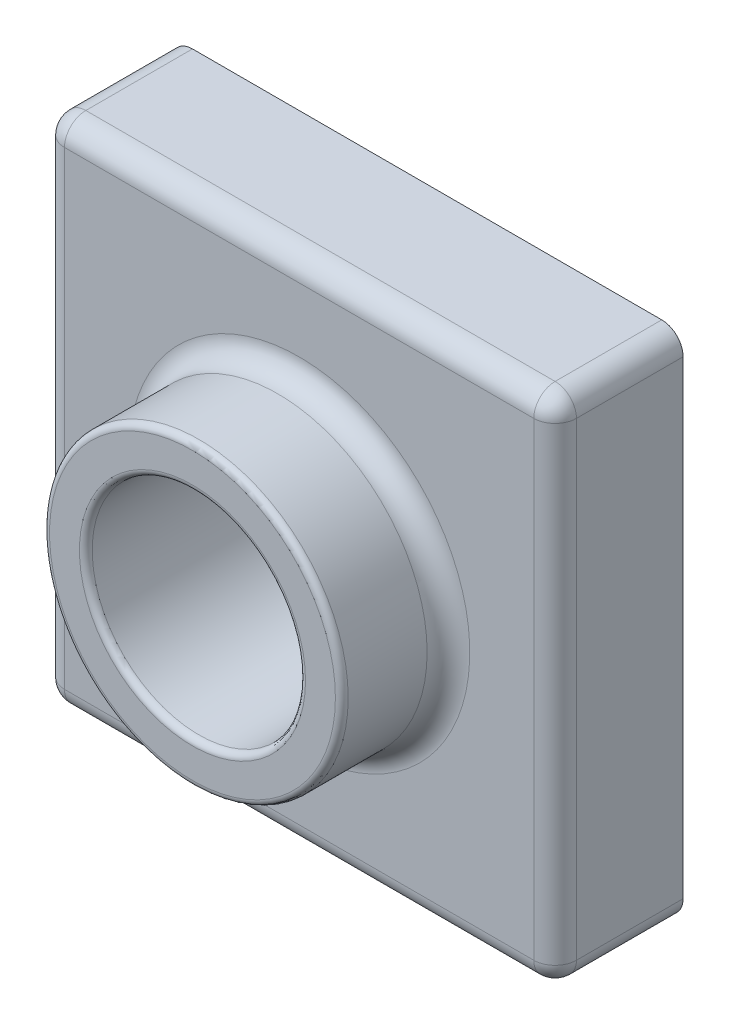
ISO-10303-21;
HEADER;
FILE_DESCRIPTION(('STEP AP214'),'2;1');
FILE_NAME('part.step','',(''),(''),'','','');
FILE_SCHEMA(('AUTOMOTIVE_DESIGN { 1 0 10303 214 1 1 1 1 }'));
ENDSEC;
DATA;
#1=APPLICATION_CONTEXT('core data for automotive mechanical design processes');
#2=APPLICATION_PROTOCOL_DEFINITION('international standard','automotive_design',2000,#1);
#3=PRODUCT_CONTEXT('',#1,'mechanical');
#4=PRODUCT('Part','Part','',(#3));
#5=PRODUCT_RELATED_PRODUCT_CATEGORY('part','',(#4));
#6=PRODUCT_DEFINITION_FORMATION('','',#4);
#7=PRODUCT_DEFINITION_CONTEXT('part definition',#1,'design');
#8=PRODUCT_DEFINITION('design','',#6,#7);
#9=PRODUCT_DEFINITION_SHAPE('','',#8);
#10=(LENGTH_UNIT() NAMED_UNIT(*) SI_UNIT(.MILLI.,.METRE.));
#11=(NAMED_UNIT(*) PLANE_ANGLE_UNIT() SI_UNIT($,.RADIAN.));
#12=(NAMED_UNIT(*) SI_UNIT($,.STERADIAN.) SOLID_ANGLE_UNIT());
#13=UNCERTAINTY_MEASURE_WITH_UNIT(LENGTH_MEASURE(1.E-05),#10,'distance_accuracy_value','');
#14=(GEOMETRIC_REPRESENTATION_CONTEXT(3) GLOBAL_UNCERTAINTY_ASSIGNED_CONTEXT((#13)) GLOBAL_UNIT_ASSIGNED_CONTEXT((#10,
#11,#12)) REPRESENTATION_CONTEXT('',''));
#15=CARTESIAN_POINT('',(0.,0.,0.));
#16=DIRECTION('',(0.,0.,1.));
#17=DIRECTION('',(1.,0.,0.));
#18=AXIS2_PLACEMENT_3D('',#15,#16,#17);
#19=CARTESIAN_POINT('',(0.,120.,30.));
#20=DIRECTION('',(0.,0.,-1.));
#21=DIRECTION('',(-1.,0.,0.));
#22=AXIS2_PLACEMENT_3D('',#19,#20,#21);
#23=PLANE('',#22);
#24=CARTESIAN_POINT('',(60.,60.,30.));
#25=DIRECTION('',(0.,0.,-1.));
#26=DIRECTION('',(-1.,0.,0.));
#27=AXIS2_PLACEMENT_3D('',#24,#25,#26);
#28=CIRCLE('',#27,40.);
#29=CARTESIAN_POINT('',(20.,60.,30.));
#30=VERTEX_POINT('',#29);
#31=EDGE_CURVE('E153',#30,#30,#28,.T.);
#32=ORIENTED_EDGE('',*,*,#31,.T.);
#33=EDGE_LOOP('',(#32));
#34=FACE_BOUND('',#33,.T.);
#35=DIRECTION('',(0.,1.,0.));
#36=VECTOR('',#35,1.);
#37=CARTESIAN_POINT('',(115.,120.,30.));
#38=LINE('',#37,#36);
#39=CARTESIAN_POINT('',(115.,5.,30.));
#40=VERTEX_POINT('',#39);
#41=CARTESIAN_POINT('',(115.,115.,30.));
#42=VERTEX_POINT('',#41);
#43=EDGE_CURVE('E151',#40,#42,#38,.T.);
#44=ORIENTED_EDGE('',*,*,#43,.T.);
#45=DIRECTION('',(-1.,0.,0.));
#46=VECTOR('',#45,1.);
#47=CARTESIAN_POINT('',(0.,115.,30.));
#48=LINE('',#47,#46);
#49=CARTESIAN_POINT('',(5.,115.,30.));
#50=VERTEX_POINT('',#49);
#51=EDGE_CURVE('E124',#42,#50,#48,.T.);
#52=ORIENTED_EDGE('',*,*,#51,.T.);
#53=DIRECTION('',(0.,-1.,0.));
#54=VECTOR('',#53,1.);
#55=CARTESIAN_POINT('',(5.,120.,30.));
#56=LINE('',#55,#54);
#57=CARTESIAN_POINT('',(5.,5.,30.));
#58=VERTEX_POINT('',#57);
#59=EDGE_CURVE('E141',#50,#58,#56,.T.);
#60=ORIENTED_EDGE('',*,*,#59,.T.);
#61=DIRECTION('',(1.,0.,0.));
#62=VECTOR('',#61,1.);
#63=CARTESIAN_POINT('',(0.,5.,30.));
#64=LINE('',#63,#62);
#65=EDGE_CURVE('E147',#58,#40,#64,.T.);
#66=ORIENTED_EDGE('',*,*,#65,.T.);
#67=EDGE_LOOP('',(#44,#52,#60,#66));
#68=FACE_BOUND('',#67,.T.);
#69=ADVANCED_FACE('F42',(#34,#68),#23,.F.);
#70=CARTESIAN_POINT('',(0.,0.,30.));
#71=DIRECTION('',(1.,0.,0.));
#72=DIRECTION('',(0.,0.,-1.));
#73=AXIS2_PLACEMENT_3D('',#70,#71,#72);
#74=PLANE('',#73);
#75=DIRECTION('',(0.,-1.,0.));
#76=VECTOR('',#75,1.);
#77=CARTESIAN_POINT('',(0.,0.,0.));
#78=LINE('',#77,#76);
#79=CARTESIAN_POINT('',(0.,115.,0.));
#80=VERTEX_POINT('',#79);
#81=CARTESIAN_POINT('',(0.,5.,0.));
#82=VERTEX_POINT('',#81);
#83=EDGE_CURVE('E247',#80,#82,#78,.T.);
#84=ORIENTED_EDGE('',*,*,#83,.T.);
#85=DIRECTION('',(0.,0.,-1.));
#86=VECTOR('',#85,1.);
#87=CARTESIAN_POINT('',(0.,5.,30.));
#88=LINE('',#87,#86);
#89=CARTESIAN_POINT('',(0.,5.,25.));
#90=VERTEX_POINT('',#89);
#91=EDGE_CURVE('E57',#82,#90,#88,.F.);
#92=ORIENTED_EDGE('',*,*,#91,.T.);
#93=DIRECTION('',(0.,-1.,0.));
#94=VECTOR('',#93,1.);
#95=CARTESIAN_POINT('',(0.,0.,25.));
#96=LINE('',#95,#94);
#97=CARTESIAN_POINT('',(0.,115.,25.));
#98=VERTEX_POINT('',#97);
#99=EDGE_CURVE('E62',#90,#98,#96,.F.);
#100=ORIENTED_EDGE('',*,*,#99,.T.);
#101=DIRECTION('',(0.,0.,-1.));
#102=VECTOR('',#101,1.);
#103=CARTESIAN_POINT('',(0.,115.,30.));
#104=LINE('',#103,#102);
#105=EDGE_CURVE('E177',#98,#80,#104,.T.);
#106=ORIENTED_EDGE('',*,*,#105,.T.);
#107=EDGE_LOOP('',(#84,#92,#100,#106));
#108=FACE_BOUND('',#107,.T.);
#109=ADVANCED_FACE('F290',(#108),#74,.F.);
#110=CARTESIAN_POINT('',(0.,0.,30.));
#111=DIRECTION('',(0.,1.,0.));
#112=DIRECTION('',(0.,0.,1.));
#113=AXIS2_PLACEMENT_3D('',#110,#111,#112);
#114=PLANE('',#113);
#115=DIRECTION('',(1.,0.,0.));
#116=VECTOR('',#115,1.);
#117=CARTESIAN_POINT('',(0.,0.,25.));
#118=LINE('',#117,#116);
#119=CARTESIAN_POINT('',(115.,0.,25.));
#120=VERTEX_POINT('',#119);
#121=CARTESIAN_POINT('',(5.,0.,25.));
#122=VERTEX_POINT('',#121);
#123=EDGE_CURVE('E173',#120,#122,#118,.F.);
#124=ORIENTED_EDGE('',*,*,#123,.T.);
#125=DIRECTION('',(0.,0.,-1.));
#126=VECTOR('',#125,1.);
#127=CARTESIAN_POINT('',(5.,0.,30.));
#128=LINE('',#127,#126);
#129=CARTESIAN_POINT('',(5.,0.,0.));
#130=VERTEX_POINT('',#129);
#131=EDGE_CURVE('E175',#122,#130,#128,.T.);
#132=ORIENTED_EDGE('',*,*,#131,.T.);
#133=DIRECTION('',(1.,0.,0.));
#134=VECTOR('',#133,1.);
#135=CARTESIAN_POINT('',(0.,0.,0.));
#136=LINE('',#135,#134);
#137=CARTESIAN_POINT('',(115.,0.,0.));
#138=VERTEX_POINT('',#137);
#139=EDGE_CURVE('E249',#130,#138,#136,.T.);
#140=ORIENTED_EDGE('',*,*,#139,.T.);
#141=DIRECTION('',(0.,0.,-1.));
#142=VECTOR('',#141,1.);
#143=CARTESIAN_POINT('',(115.,0.,30.));
#144=LINE('',#143,#142);
#145=EDGE_CURVE('E171',#138,#120,#144,.F.);
#146=ORIENTED_EDGE('',*,*,#145,.T.);
#147=EDGE_LOOP('',(#124,#132,#140,#146));
#148=FACE_BOUND('',#147,.T.);
#149=ADVANCED_FACE('F314',(#148),#114,.F.);
#150=CARTESIAN_POINT('',(120.,0.,30.));
#151=DIRECTION('',(-1.,0.,0.));
#152=DIRECTION('',(0.,0.,1.));
#153=AXIS2_PLACEMENT_3D('',#150,#151,#152);
#154=PLANE('',#153);
#155=DIRECTION('',(0.,1.,0.));
#156=VECTOR('',#155,1.);
#157=CARTESIAN_POINT('',(120.,0.,25.));
#158=LINE('',#157,#156);
#159=CARTESIAN_POINT('',(120.,115.,25.));
#160=VERTEX_POINT('',#159);
#161=CARTESIAN_POINT('',(120.,5.,25.));
#162=VERTEX_POINT('',#161);
#163=EDGE_CURVE('E167',#160,#162,#158,.F.);
#164=ORIENTED_EDGE('',*,*,#163,.T.);
#165=DIRECTION('',(0.,0.,-1.));
#166=VECTOR('',#165,1.);
#167=CARTESIAN_POINT('',(120.,5.,30.));
#168=LINE('',#167,#166);
#169=CARTESIAN_POINT('',(120.,5.,0.));
#170=VERTEX_POINT('',#169);
#171=EDGE_CURVE('E169',#162,#170,#168,.T.);
#172=ORIENTED_EDGE('',*,*,#171,.T.);
#173=DIRECTION('',(0.,1.,0.));
#174=VECTOR('',#173,1.);
#175=CARTESIAN_POINT('',(120.,0.,0.));
#176=LINE('',#175,#174);
#177=CARTESIAN_POINT('',(120.,115.,0.));
#178=VERTEX_POINT('',#177);
#179=EDGE_CURVE('E254',#170,#178,#176,.T.);
#180=ORIENTED_EDGE('',*,*,#179,.T.);
#181=DIRECTION('',(0.,0.,-1.));
#182=VECTOR('',#181,1.);
#183=CARTESIAN_POINT('',(120.,115.,30.));
#184=LINE('',#183,#182);
#185=EDGE_CURVE('E165',#178,#160,#184,.F.);
#186=ORIENTED_EDGE('',*,*,#185,.T.);
#187=EDGE_LOOP('',(#164,#172,#180,#186));
#188=FACE_BOUND('',#187,.T.);
#189=ADVANCED_FACE('F322',(#188),#154,.F.);
#190=CARTESIAN_POINT('',(0.,120.,30.));
#191=DIRECTION('',(0.,-1.,0.));
#192=DIRECTION('',(0.,0.,-1.));
#193=AXIS2_PLACEMENT_3D('',#190,#191,#192);
#194=PLANE('',#193);
#195=DIRECTION('',(-1.,0.,0.));
#196=VECTOR('',#195,1.);
#197=CARTESIAN_POINT('',(0.,120.,25.));
#198=LINE('',#197,#196);
#199=CARTESIAN_POINT('',(5.,120.,25.));
#200=VERTEX_POINT('',#199);
#201=CARTESIAN_POINT('',(115.,120.,25.));
#202=VERTEX_POINT('',#201);
#203=EDGE_CURVE('E126',#200,#202,#198,.F.);
#204=ORIENTED_EDGE('',*,*,#203,.T.);
#205=DIRECTION('',(0.,0.,-1.));
#206=VECTOR('',#205,1.);
#207=CARTESIAN_POINT('',(115.,120.,30.));
#208=LINE('',#207,#206);
#209=CARTESIAN_POINT('',(115.,120.,0.));
#210=VERTEX_POINT('',#209);
#211=EDGE_CURVE('E163',#202,#210,#208,.T.);
#212=ORIENTED_EDGE('',*,*,#211,.T.);
#213=DIRECTION('',(-1.,0.,0.));
#214=VECTOR('',#213,1.);
#215=CARTESIAN_POINT('',(0.,120.,0.));
#216=LINE('',#215,#214);
#217=CARTESIAN_POINT('',(5.,120.,0.));
#218=VERTEX_POINT('',#217);
#219=EDGE_CURVE('E257',#210,#218,#216,.T.);
#220=ORIENTED_EDGE('',*,*,#219,.T.);
#221=DIRECTION('',(0.,0.,-1.));
#222=VECTOR('',#221,1.);
#223=CARTESIAN_POINT('',(5.,120.,30.));
#224=LINE('',#223,#222);
#225=EDGE_CURVE('E156',#218,#200,#224,.F.);
#226=ORIENTED_EDGE('',*,*,#225,.T.);
#227=EDGE_LOOP('',(#204,#212,#220,#226));
#228=FACE_BOUND('',#227,.T.);
#229=ADVANCED_FACE('F284',(#228),#194,.F.);
#230=CARTESIAN_POINT('',(0.,120.,0.));
#231=DIRECTION('',(0.,0.,-1.));
#232=DIRECTION('',(-1.,0.,0.));
#233=AXIS2_PLACEMENT_3D('',#230,#231,#232);
#234=PLANE('',#233);
#235=CARTESIAN_POINT('',(60.,60.,0.));
#236=DIRECTION('',(0.,0.,1.));
#237=DIRECTION('',(1.,0.,0.));
#238=AXIS2_PLACEMENT_3D('',#235,#236,#237);
#239=CIRCLE('',#238,25.);
#240=CARTESIAN_POINT('',(85.,60.,0.));
#241=VERTEX_POINT('',#240);
#242=EDGE_CURVE('E213',#241,#241,#239,.T.);
#243=ORIENTED_EDGE('',*,*,#242,.T.);
#244=EDGE_LOOP('',(#243));
#245=FACE_BOUND('',#244,.T.);
#246=ORIENTED_EDGE('',*,*,#139,.F.);
#247=CARTESIAN_POINT('',(5.,5.,0.));
#248=DIRECTION('',(0.,0.,-1.));
#249=DIRECTION('',(-1.,0.,0.));
#250=AXIS2_PLACEMENT_3D('',#247,#248,#249);
#251=CIRCLE('',#250,5.);
#252=EDGE_CURVE('E187',#130,#82,#251,.T.);
#253=ORIENTED_EDGE('',*,*,#252,.T.);
#254=ORIENTED_EDGE('',*,*,#83,.F.);
#255=CARTESIAN_POINT('',(5.,115.,0.));
#256=DIRECTION('',(0.,0.,-1.));
#257=DIRECTION('',(-1.,0.,0.));
#258=AXIS2_PLACEMENT_3D('',#255,#256,#257);
#259=CIRCLE('',#258,5.);
#260=EDGE_CURVE('E181',#80,#218,#259,.T.);
#261=ORIENTED_EDGE('',*,*,#260,.T.);
#262=ORIENTED_EDGE('',*,*,#219,.F.);
#263=CARTESIAN_POINT('',(115.,115.,0.));
#264=DIRECTION('',(0.,0.,-1.));
#265=DIRECTION('',(-1.,0.,0.));
#266=AXIS2_PLACEMENT_3D('',#263,#264,#265);
#267=CIRCLE('',#266,5.);
#268=EDGE_CURVE('E183',#210,#178,#267,.T.);
#269=ORIENTED_EDGE('',*,*,#268,.T.);
#270=ORIENTED_EDGE('',*,*,#179,.F.);
#271=CARTESIAN_POINT('',(115.,5.,0.));
#272=DIRECTION('',(0.,0.,-1.));
#273=DIRECTION('',(-1.,0.,0.));
#274=AXIS2_PLACEMENT_3D('',#271,#272,#273);
#275=CIRCLE('',#274,5.);
#276=EDGE_CURVE('E185',#170,#138,#275,.T.);
#277=ORIENTED_EDGE('',*,*,#276,.T.);
#278=EDGE_LOOP('',(#246,#253,#254,#261,#262,#269,#270,#277));
#279=FACE_BOUND('',#278,.T.);
#280=ADVANCED_FACE('F293',(#245,#279),#234,.T.);
#281=CARTESIAN_POINT('',(60.,60.,55.));
#282=DIRECTION('',(0.,0.,-1.));
#283=DIRECTION('',(-1.,0.,0.));
#284=AXIS2_PLACEMENT_3D('',#281,#282,#283);
#285=CYLINDRICAL_SURFACE('',#284,35.);
#286=CARTESIAN_POINT('',(60.,60.,53.5));
#287=DIRECTION('',(0.,0.,1.));
#288=DIRECTION('',(1.,0.,0.));
#289=AXIS2_PLACEMENT_3D('',#286,#287,#288);
#290=CIRCLE('',#289,35.);
#291=CARTESIAN_POINT('',(95.,60.,53.5));
#292=VERTEX_POINT('',#291);
#293=EDGE_CURVE('E50',#292,#292,#290,.F.);
#294=ORIENTED_EDGE('',*,*,#293,.T.);
#295=EDGE_LOOP('',(#294));
#296=FACE_BOUND('',#295,.T.);
#297=CARTESIAN_POINT('',(60.,60.,35.));
#298=DIRECTION('',(0.,0.,-1.));
#299=DIRECTION('',(-1.,0.,0.));
#300=AXIS2_PLACEMENT_3D('',#297,#298,#299);
#301=CIRCLE('',#300,35.);
#302=CARTESIAN_POINT('',(25.,60.,35.));
#303=VERTEX_POINT('',#302);
#304=EDGE_CURVE('E148',#303,#303,#301,.F.);
#305=ORIENTED_EDGE('',*,*,#304,.T.);
#306=EDGE_LOOP('',(#305));
#307=FACE_BOUND('',#306,.T.);
#308=ADVANCED_FACE('F221',(#296,#307),#285,.T.);
#309=CARTESIAN_POINT('',(60.,60.,55.));
#310=DIRECTION('',(0.,0.,1.));
#311=DIRECTION('',(1.,0.,0.));
#312=AXIS2_PLACEMENT_3D('',#309,#310,#311);
#313=PLANE('',#312);
#314=CARTESIAN_POINT('',(60.,60.,55.));
#315=DIRECTION('',(0.,0.,1.));
#316=DIRECTION('',(1.,0.,0.));
#317=AXIS2_PLACEMENT_3D('',#314,#315,#316);
#318=CIRCLE('',#317,33.5);
#319=CARTESIAN_POINT('',(93.5,60.,55.));
#320=VERTEX_POINT('',#319);
#321=EDGE_CURVE('E216',#320,#320,#318,.T.);
#322=ORIENTED_EDGE('',*,*,#321,.T.);
#323=EDGE_LOOP('',(#322));
#324=FACE_BOUND('',#323,.T.);
#325=CARTESIAN_POINT('',(60.,60.,55.));
#326=DIRECTION('',(0.,0.,1.));
#327=DIRECTION('',(1.,0.,0.));
#328=AXIS2_PLACEMENT_3D('',#325,#326,#327);
#329=CIRCLE('',#328,26.5);
#330=CARTESIAN_POINT('',(86.5,60.,55.));
#331=VERTEX_POINT('',#330);
#332=EDGE_CURVE('E188',#331,#331,#329,.F.);
#333=ORIENTED_EDGE('',*,*,#332,.T.);
#334=EDGE_LOOP('',(#333));
#335=FACE_BOUND('',#334,.T.);
#336=ADVANCED_FACE('F229',(#324,#335),#313,.T.);
#337=CARTESIAN_POINT('',(60.,60.,0.));
#338=DIRECTION('',(0.,0.,1.));
#339=DIRECTION('',(1.,0.,0.));
#340=AXIS2_PLACEMENT_3D('',#337,#338,#339);
#341=CYLINDRICAL_SURFACE('',#340,25.);
#342=CARTESIAN_POINT('',(60.,60.,53.5));
#343=DIRECTION('',(0.,0.,1.));
#344=DIRECTION('',(1.,0.,0.));
#345=AXIS2_PLACEMENT_3D('',#342,#343,#344);
#346=CIRCLE('',#345,25.);
#347=CARTESIAN_POINT('',(85.,60.,53.5));
#348=VERTEX_POINT('',#347);
#349=EDGE_CURVE('E11',#348,#348,#346,.T.);
#350=ORIENTED_EDGE('',*,*,#349,.T.);
#351=EDGE_LOOP('',(#350));
#352=FACE_BOUND('',#351,.T.);
#353=ORIENTED_EDGE('',*,*,#242,.F.);
#354=EDGE_LOOP('',(#353));
#355=FACE_BOUND('',#354,.T.);
#356=ADVANCED_FACE('F232',(#352,#355),#341,.F.);
#357=CARTESIAN_POINT('',(60.,60.,35.));
#358=DIRECTION('',(0.,0.,-1.));
#359=DIRECTION('',(-1.,0.,0.));
#360=AXIS2_PLACEMENT_3D('',#357,#358,#359);
#361=TOROIDAL_SURFACE('',#360,40.,5.);
#362=ORIENTED_EDGE('',*,*,#31,.F.);
#363=EDGE_LOOP('',(#362));
#364=FACE_BOUND('',#363,.T.);
#365=ORIENTED_EDGE('',*,*,#304,.F.);
#366=EDGE_LOOP('',(#365));
#367=FACE_BOUND('',#366,.T.);
#368=ADVANCED_FACE('F242',(#364,#367),#361,.F.);
#369=CARTESIAN_POINT('',(115.,5.,30.));
#370=DIRECTION('',(0.,0.,-1.));
#371=DIRECTION('',(-1.,0.,0.));
#372=AXIS2_PLACEMENT_3D('',#369,#370,#371);
#373=CYLINDRICAL_SURFACE('',#372,5.);
#374=ORIENTED_EDGE('',*,*,#276,.F.);
#375=ORIENTED_EDGE('',*,*,#171,.F.);
#376=CARTESIAN_POINT('',(115.,5.,25.));
#377=DIRECTION('',(0.,0.,1.));
#378=DIRECTION('',(1.,0.,0.));
#379=AXIS2_PLACEMENT_3D('',#376,#377,#378);
#380=CIRCLE('',#379,5.);
#381=EDGE_CURVE('E210',#120,#162,#380,.T.);
#382=ORIENTED_EDGE('',*,*,#381,.F.);
#383=ORIENTED_EDGE('',*,*,#145,.F.);
#384=EDGE_LOOP('',(#374,#375,#382,#383));
#385=FACE_BOUND('',#384,.T.);
#386=ADVANCED_FACE('F331',(#385),#373,.T.);
#387=CARTESIAN_POINT('',(0.,5.,25.));
#388=DIRECTION('',(1.,0.,0.));
#389=DIRECTION('',(0.,0.,-1.));
#390=AXIS2_PLACEMENT_3D('',#387,#388,#389);
#391=CYLINDRICAL_SURFACE('',#390,5.);
#392=CARTESIAN_POINT('',(5.,5.,25.));
#393=DIRECTION('',(-1.,0.,0.));
#394=DIRECTION('',(0.,0.,1.));
#395=AXIS2_PLACEMENT_3D('',#392,#393,#394);
#396=CIRCLE('',#395,5.);
#397=EDGE_CURVE('E204',#122,#58,#396,.T.);
#398=ORIENTED_EDGE('',*,*,#397,.F.);
#399=ORIENTED_EDGE('',*,*,#123,.F.);
#400=CARTESIAN_POINT('',(115.,5.,25.));
#401=DIRECTION('',(1.,0.,0.));
#402=DIRECTION('',(0.,0.,-1.));
#403=AXIS2_PLACEMENT_3D('',#400,#401,#402);
#404=CIRCLE('',#403,5.);
#405=EDGE_CURVE('E207',#40,#120,#404,.T.);
#406=ORIENTED_EDGE('',*,*,#405,.F.);
#407=ORIENTED_EDGE('',*,*,#65,.F.);
#408=EDGE_LOOP('',(#398,#399,#406,#407));
#409=FACE_BOUND('',#408,.T.);
#410=ADVANCED_FACE('F266',(#409),#391,.T.);
#411=CARTESIAN_POINT('',(5.,5.,30.));
#412=DIRECTION('',(0.,0.,-1.));
#413=DIRECTION('',(-1.,0.,0.));
#414=AXIS2_PLACEMENT_3D('',#411,#412,#413);
#415=CYLINDRICAL_SURFACE('',#414,5.);
#416=ORIENTED_EDGE('',*,*,#252,.F.);
#417=ORIENTED_EDGE('',*,*,#131,.F.);
#418=CARTESIAN_POINT('',(5.,5.,25.));
#419=DIRECTION('',(0.,0.,1.));
#420=DIRECTION('',(1.,0.,0.));
#421=AXIS2_PLACEMENT_3D('',#418,#419,#420);
#422=CIRCLE('',#421,5.);
#423=EDGE_CURVE('E201',#90,#122,#422,.T.);
#424=ORIENTED_EDGE('',*,*,#423,.F.);
#425=ORIENTED_EDGE('',*,*,#91,.F.);
#426=EDGE_LOOP('',(#416,#417,#424,#425));
#427=FACE_BOUND('',#426,.T.);
#428=ADVANCED_FACE('F297',(#427),#415,.T.);
#429=CARTESIAN_POINT('',(115.,5.,25.));
#430=DIRECTION('',(0.,0.,1.));
#431=DIRECTION('',(1.,0.,0.));
#432=AXIS2_PLACEMENT_3D('',#429,#430,#431);
#433=SPHERICAL_SURFACE('',#432,5.);
#434=ORIENTED_EDGE('',*,*,#405,.T.);
#435=ORIENTED_EDGE('',*,*,#381,.T.);
#436=CARTESIAN_POINT('',(115.,5.,25.));
#437=DIRECTION('',(0.,-1.,0.));
#438=DIRECTION('',(0.,0.,-1.));
#439=AXIS2_PLACEMENT_3D('',#436,#437,#438);
#440=CIRCLE('',#439,5.);
#441=EDGE_CURVE('E198',#40,#162,#440,.F.);
#442=ORIENTED_EDGE('',*,*,#441,.F.);
#443=EDGE_LOOP('',(#434,#435,#442));
#444=FACE_BOUND('',#443,.T.);
#445=ADVANCED_FACE('F269',(#444),#433,.T.);
#446=CARTESIAN_POINT('',(5.,5.,25.));
#447=DIRECTION('',(0.,0.,1.));
#448=DIRECTION('',(1.,0.,0.));
#449=AXIS2_PLACEMENT_3D('',#446,#447,#448);
#450=SPHERICAL_SURFACE('',#449,5.);
#451=ORIENTED_EDGE('',*,*,#423,.T.);
#452=ORIENTED_EDGE('',*,*,#397,.T.);
#453=CARTESIAN_POINT('',(5.,5.,25.));
#454=DIRECTION('',(0.,-1.,0.));
#455=DIRECTION('',(1.,0.,0.));
#456=AXIS2_PLACEMENT_3D('',#453,#454,#455);
#457=CIRCLE('',#456,5.);
#458=EDGE_CURVE('E144',#90,#58,#457,.F.);
#459=ORIENTED_EDGE('',*,*,#458,.F.);
#460=EDGE_LOOP('',(#451,#452,#459));
#461=FACE_BOUND('',#460,.T.);
#462=ADVANCED_FACE('F299',(#461),#450,.T.);
#463=CARTESIAN_POINT('',(115.,115.,30.));
#464=DIRECTION('',(0.,0.,-1.));
#465=DIRECTION('',(-1.,0.,0.));
#466=AXIS2_PLACEMENT_3D('',#463,#464,#465);
#467=CYLINDRICAL_SURFACE('',#466,5.);
#468=ORIENTED_EDGE('',*,*,#268,.F.);
#469=ORIENTED_EDGE('',*,*,#211,.F.);
#470=CARTESIAN_POINT('',(115.,115.,25.));
#471=DIRECTION('',(0.,0.,1.));
#472=DIRECTION('',(1.,0.,0.));
#473=AXIS2_PLACEMENT_3D('',#470,#471,#472);
#474=CIRCLE('',#473,5.);
#475=EDGE_CURVE('E194',#160,#202,#474,.T.);
#476=ORIENTED_EDGE('',*,*,#475,.F.);
#477=ORIENTED_EDGE('',*,*,#185,.F.);
#478=EDGE_LOOP('',(#468,#469,#476,#477));
#479=FACE_BOUND('',#478,.T.);
#480=ADVANCED_FACE('F281',(#479),#467,.T.);
#481=CARTESIAN_POINT('',(115.,120.,25.));
#482=DIRECTION('',(0.,1.,0.));
#483=DIRECTION('',(0.,0.,1.));
#484=AXIS2_PLACEMENT_3D('',#481,#482,#483);
#485=CYLINDRICAL_SURFACE('',#484,5.);
#486=ORIENTED_EDGE('',*,*,#441,.T.);
#487=ORIENTED_EDGE('',*,*,#163,.F.);
#488=CARTESIAN_POINT('',(115.,115.,25.));
#489=DIRECTION('',(0.,1.,0.));
#490=DIRECTION('',(0.,0.,1.));
#491=AXIS2_PLACEMENT_3D('',#488,#489,#490);
#492=CIRCLE('',#491,5.);
#493=EDGE_CURVE('E138',#42,#160,#492,.T.);
#494=ORIENTED_EDGE('',*,*,#493,.F.);
#495=ORIENTED_EDGE('',*,*,#43,.F.);
#496=EDGE_LOOP('',(#486,#487,#494,#495));
#497=FACE_BOUND('',#496,.T.);
#498=ADVANCED_FACE('F272',(#497),#485,.T.);
#499=CARTESIAN_POINT('',(5.,120.,25.));
#500=DIRECTION('',(0.,-1.,0.));
#501=DIRECTION('',(0.,0.,-1.));
#502=AXIS2_PLACEMENT_3D('',#499,#500,#501);
#503=CYLINDRICAL_SURFACE('',#502,5.);
#504=ORIENTED_EDGE('',*,*,#458,.T.);
#505=ORIENTED_EDGE('',*,*,#59,.F.);
#506=CARTESIAN_POINT('',(5.,115.,25.));
#507=DIRECTION('',(0.,1.,0.));
#508=DIRECTION('',(0.,0.,1.));
#509=AXIS2_PLACEMENT_3D('',#506,#507,#508);
#510=CIRCLE('',#509,5.);
#511=EDGE_CURVE('E132',#98,#50,#510,.T.);
#512=ORIENTED_EDGE('',*,*,#511,.F.);
#513=ORIENTED_EDGE('',*,*,#99,.F.);
#514=EDGE_LOOP('',(#504,#505,#512,#513));
#515=FACE_BOUND('',#514,.T.);
#516=ADVANCED_FACE('F142',(#515),#503,.T.);
#517=CARTESIAN_POINT('',(5.,115.,30.));
#518=DIRECTION('',(0.,0.,-1.));
#519=DIRECTION('',(-1.,0.,0.));
#520=AXIS2_PLACEMENT_3D('',#517,#518,#519);
#521=CYLINDRICAL_SURFACE('',#520,5.);
#522=ORIENTED_EDGE('',*,*,#260,.F.);
#523=ORIENTED_EDGE('',*,*,#105,.F.);
#524=CARTESIAN_POINT('',(5.,115.,25.));
#525=DIRECTION('',(0.,0.,1.));
#526=DIRECTION('',(1.,0.,0.));
#527=AXIS2_PLACEMENT_3D('',#524,#525,#526);
#528=CIRCLE('',#527,5.);
#529=EDGE_CURVE('E136',#200,#98,#528,.T.);
#530=ORIENTED_EDGE('',*,*,#529,.F.);
#531=ORIENTED_EDGE('',*,*,#225,.F.);
#532=EDGE_LOOP('',(#522,#523,#530,#531));
#533=FACE_BOUND('',#532,.T.);
#534=ADVANCED_FACE('F288',(#533),#521,.T.);
#535=CARTESIAN_POINT('',(115.,115.,25.));
#536=DIRECTION('',(0.,0.,1.));
#537=DIRECTION('',(1.,0.,0.));
#538=AXIS2_PLACEMENT_3D('',#535,#536,#537);
#539=SPHERICAL_SURFACE('',#538,5.);
#540=ORIENTED_EDGE('',*,*,#493,.T.);
#541=ORIENTED_EDGE('',*,*,#475,.T.);
#542=CARTESIAN_POINT('',(115.,115.,25.));
#543=DIRECTION('',(1.,0.,0.));
#544=DIRECTION('',(0.,0.,-1.));
#545=AXIS2_PLACEMENT_3D('',#542,#543,#544);
#546=CIRCLE('',#545,5.);
#547=EDGE_CURVE('E129',#42,#202,#546,.F.);
#548=ORIENTED_EDGE('',*,*,#547,.F.);
#549=EDGE_LOOP('',(#540,#541,#548));
#550=FACE_BOUND('',#549,.T.);
#551=ADVANCED_FACE('F276',(#550),#539,.T.);
#552=CARTESIAN_POINT('',(5.,115.,25.));
#553=DIRECTION('',(0.,0.,1.));
#554=DIRECTION('',(1.,0.,0.));
#555=AXIS2_PLACEMENT_3D('',#552,#553,#554);
#556=SPHERICAL_SURFACE('',#555,5.);
#557=ORIENTED_EDGE('',*,*,#529,.T.);
#558=ORIENTED_EDGE('',*,*,#511,.T.);
#559=CARTESIAN_POINT('',(5.,115.,25.));
#560=DIRECTION('',(-1.,0.,0.));
#561=DIRECTION('',(0.,0.,1.));
#562=AXIS2_PLACEMENT_3D('',#559,#560,#561);
#563=CIRCLE('',#562,5.);
#564=EDGE_CURVE('E120',#200,#50,#563,.F.);
#565=ORIENTED_EDGE('',*,*,#564,.F.);
#566=EDGE_LOOP('',(#557,#558,#565));
#567=FACE_BOUND('',#566,.T.);
#568=ADVANCED_FACE('F134',(#567),#556,.T.);
#569=CARTESIAN_POINT('',(0.,115.,25.));
#570=DIRECTION('',(-1.,0.,0.));
#571=DIRECTION('',(0.,0.,1.));
#572=AXIS2_PLACEMENT_3D('',#569,#570,#571);
#573=CYLINDRICAL_SURFACE('',#572,5.);
#574=ORIENTED_EDGE('',*,*,#547,.T.);
#575=ORIENTED_EDGE('',*,*,#203,.F.);
#576=ORIENTED_EDGE('',*,*,#564,.T.);
#577=ORIENTED_EDGE('',*,*,#51,.F.);
#578=EDGE_LOOP('',(#574,#575,#576,#577));
#579=FACE_BOUND('',#578,.T.);
#580=ADVANCED_FACE('F122',(#579),#573,.T.);
#581=CARTESIAN_POINT('',(60.,60.,53.5));
#582=DIRECTION('',(0.,0.,1.));
#583=DIRECTION('',(1.,0.,0.));
#584=AXIS2_PLACEMENT_3D('',#581,#582,#583);
#585=TOROIDAL_SURFACE('',#584,33.5,1.5);
#586=ORIENTED_EDGE('',*,*,#293,.F.);
#587=EDGE_LOOP('',(#586));
#588=FACE_BOUND('',#587,.T.);
#589=ORIENTED_EDGE('',*,*,#321,.F.);
#590=EDGE_LOOP('',(#589));
#591=FACE_BOUND('',#590,.T.);
#592=ADVANCED_FACE('F224',(#588,#591),#585,.T.);
#593=CARTESIAN_POINT('',(60.,60.,53.5));
#594=DIRECTION('',(0.,0.,1.));
#595=DIRECTION('',(1.,0.,0.));
#596=AXIS2_PLACEMENT_3D('',#593,#594,#595);
#597=TOROIDAL_SURFACE('',#596,26.5,1.5);
#598=ORIENTED_EDGE('',*,*,#332,.F.);
#599=EDGE_LOOP('',(#598));
#600=FACE_BOUND('',#599,.T.);
#601=ORIENTED_EDGE('',*,*,#349,.F.);
#602=EDGE_LOOP('',(#601));
#603=FACE_BOUND('',#602,.T.);
#604=ADVANCED_FACE('F44',(#600,#603),#597,.T.);
#605=CLOSED_SHELL('',(#69,#109,#149,#189,#229,#280,#308,#336,#356,#368,#386,#410,#428,#445,#462,
#480,#498,#516,#534,#551,#568,#580,#592,#604));
#606=MANIFOLD_SOLID_BREP('B2',#605);
#607=ADVANCED_BREP_SHAPE_REPRESENTATION('',(#18,#606),#14);
#608=SHAPE_DEFINITION_REPRESENTATION(#9,#607);
ENDSEC;
END-ISO-10303-21;
